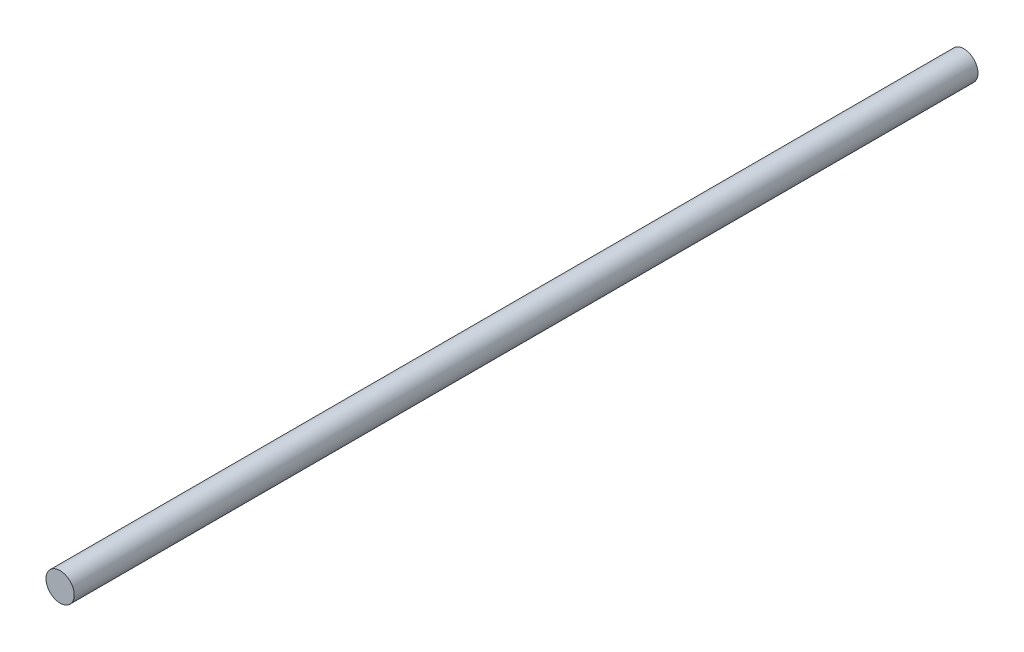
ISO-10303-21;
HEADER;
FILE_DESCRIPTION(('STEP AP214'),'2;1');
FILE_NAME('part.step','',(''),(''),'','','');
FILE_SCHEMA(('AUTOMOTIVE_DESIGN { 1 0 10303 214 1 1 1 1 }'));
ENDSEC;
DATA;
#1=APPLICATION_CONTEXT('core data for automotive mechanical design processes');
#2=APPLICATION_PROTOCOL_DEFINITION('international standard','automotive_design',2000,#1);
#3=PRODUCT_CONTEXT('',#1,'mechanical');
#4=PRODUCT('Part','Part','',(#3));
#5=PRODUCT_RELATED_PRODUCT_CATEGORY('part','',(#4));
#6=PRODUCT_DEFINITION_FORMATION('','',#4);
#7=PRODUCT_DEFINITION_CONTEXT('part definition',#1,'design');
#8=PRODUCT_DEFINITION('design','',#6,#7);
#9=PRODUCT_DEFINITION_SHAPE('','',#8);
#10=(LENGTH_UNIT() NAMED_UNIT(*) SI_UNIT(.MILLI.,.METRE.));
#11=(NAMED_UNIT(*) PLANE_ANGLE_UNIT() SI_UNIT($,.RADIAN.));
#12=(NAMED_UNIT(*) SI_UNIT($,.STERADIAN.) SOLID_ANGLE_UNIT());
#13=UNCERTAINTY_MEASURE_WITH_UNIT(LENGTH_MEASURE(1.E-05),#10,'distance_accuracy_value','');
#14=(GEOMETRIC_REPRESENTATION_CONTEXT(3) GLOBAL_UNCERTAINTY_ASSIGNED_CONTEXT((#13)) GLOBAL_UNIT_ASSIGNED_CONTEXT((#10,
#11,#12)) REPRESENTATION_CONTEXT('',''));
#15=CARTESIAN_POINT('',(0.,0.,0.));
#16=DIRECTION('',(0.,0.,1.));
#17=DIRECTION('',(1.,0.,0.));
#18=AXIS2_PLACEMENT_3D('',#15,#16,#17);
#19=CARTESIAN_POINT('',(0.,0.,160.));
#20=DIRECTION('',(0.,0.,-1.));
#21=DIRECTION('',(-1.,0.,0.));
#22=AXIS2_PLACEMENT_3D('',#19,#20,#21);
#23=CYLINDRICAL_SURFACE('',#22,2.5);
#24=CARTESIAN_POINT('',(0.,0.,160.));
#25=DIRECTION('',(0.,0.,1.));
#26=DIRECTION('',(1.,0.,0.));
#27=AXIS2_PLACEMENT_3D('',#24,#25,#26);
#28=CIRCLE('',#27,2.5);
#29=CARTESIAN_POINT('',(2.5,0.,160.));
#30=VERTEX_POINT('',#29);
#31=EDGE_CURVE('E10',#30,#30,#28,.T.);
#32=ORIENTED_EDGE('',*,*,#31,.F.);
#33=EDGE_LOOP('',(#32));
#34=FACE_BOUND('',#33,.T.);
#35=CARTESIAN_POINT('',(0.,0.,0.));
#36=DIRECTION('',(0.,0.,1.));
#37=DIRECTION('',(1.,0.,0.));
#38=AXIS2_PLACEMENT_3D('',#35,#36,#37);
#39=CIRCLE('',#38,2.5);
#40=CARTESIAN_POINT('',(2.5,0.,0.));
#41=VERTEX_POINT('',#40);
#42=EDGE_CURVE('E40',#41,#41,#39,.T.);
#43=ORIENTED_EDGE('',*,*,#42,.T.);
#44=EDGE_LOOP('',(#43));
#45=FACE_BOUND('',#44,.T.);
#46=ADVANCED_FACE('F37',(#34,#45),#23,.T.);
#47=CARTESIAN_POINT('',(0.,0.,160.));
#48=DIRECTION('',(0.,0.,1.));
#49=DIRECTION('',(1.,0.,0.));
#50=AXIS2_PLACEMENT_3D('',#47,#48,#49);
#51=PLANE('',#50);
#52=ORIENTED_EDGE('',*,*,#31,.T.);
#53=EDGE_LOOP('',(#52));
#54=FACE_BOUND('',#53,.T.);
#55=ADVANCED_FACE('F54',(#54),#51,.T.);
#56=CARTESIAN_POINT('',(0.,0.,0.));
#57=DIRECTION('',(0.,0.,1.));
#58=DIRECTION('',(1.,0.,0.));
#59=AXIS2_PLACEMENT_3D('',#56,#57,#58);
#60=PLANE('',#59);
#61=ORIENTED_EDGE('',*,*,#42,.F.);
#62=EDGE_LOOP('',(#61));
#63=FACE_BOUND('',#62,.T.);
#64=ADVANCED_FACE('F52',(#63),#60,.F.);
#65=CLOSED_SHELL('',(#46,#55,#64));
#66=MANIFOLD_SOLID_BREP('B2',#65);
#67=ADVANCED_BREP_SHAPE_REPRESENTATION('',(#18,#66),#14);
#68=SHAPE_DEFINITION_REPRESENTATION(#9,#67);
ENDSEC;
END-ISO-10303-21;
